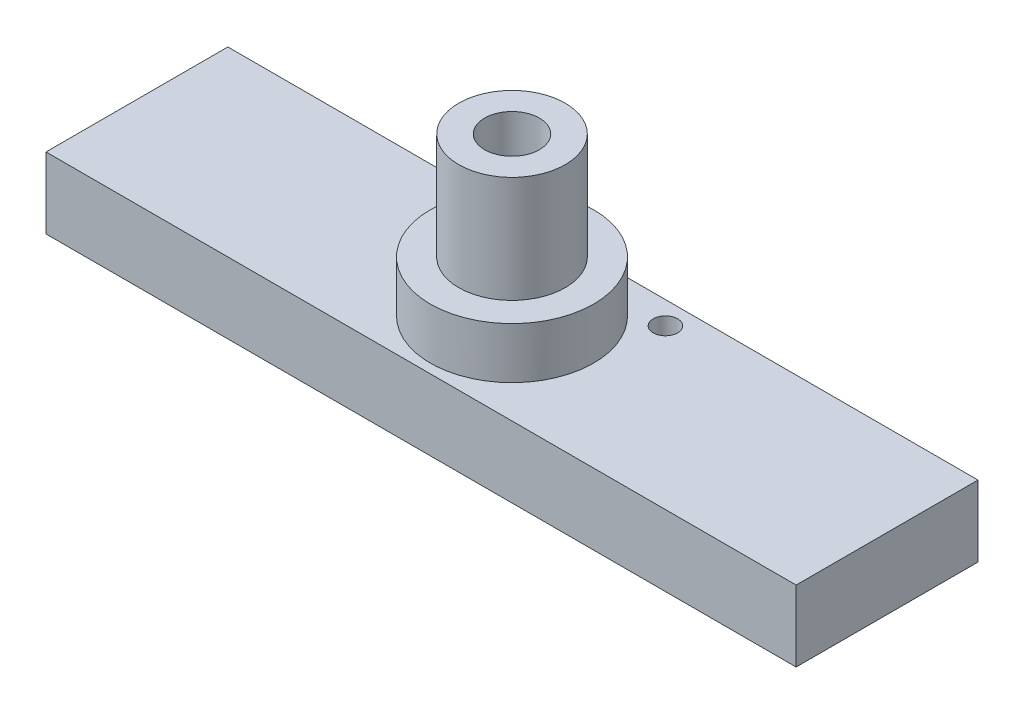
ISO-10303-21;
HEADER;
FILE_DESCRIPTION(('STEP AP214'),'2;1');
FILE_NAME('part.step','',(''),(''),'','','');
FILE_SCHEMA(('AUTOMOTIVE_DESIGN { 1 0 10303 214 1 1 1 1 }'));
ENDSEC;
DATA;
#1=APPLICATION_CONTEXT('core data for automotive mechanical design processes');
#2=APPLICATION_PROTOCOL_DEFINITION('international standard','automotive_design',2000,#1);
#3=PRODUCT_CONTEXT('',#1,'mechanical');
#4=PRODUCT('Part','Part','',(#3));
#5=PRODUCT_RELATED_PRODUCT_CATEGORY('part','',(#4));
#6=PRODUCT_DEFINITION_FORMATION('','',#4);
#7=PRODUCT_DEFINITION_CONTEXT('part definition',#1,'design');
#8=PRODUCT_DEFINITION('design','',#6,#7);
#9=PRODUCT_DEFINITION_SHAPE('','',#8);
#10=(LENGTH_UNIT() NAMED_UNIT(*) SI_UNIT(.MILLI.,.METRE.));
#11=(NAMED_UNIT(*) PLANE_ANGLE_UNIT() SI_UNIT($,.RADIAN.));
#12=(NAMED_UNIT(*) SI_UNIT($,.STERADIAN.) SOLID_ANGLE_UNIT());
#13=UNCERTAINTY_MEASURE_WITH_UNIT(LENGTH_MEASURE(1.E-05),#10,'distance_accuracy_value','');
#14=(GEOMETRIC_REPRESENTATION_CONTEXT(3) GLOBAL_UNCERTAINTY_ASSIGNED_CONTEXT((#13)) GLOBAL_UNIT_ASSIGNED_CONTEXT((#10,
#11,#12)) REPRESENTATION_CONTEXT('',''));
#15=CARTESIAN_POINT('',(0.,0.,0.));
#16=DIRECTION('',(0.,0.,1.));
#17=DIRECTION('',(1.,0.,0.));
#18=AXIS2_PLACEMENT_3D('',#15,#16,#17);
#19=CARTESIAN_POINT('',(0.,6.35,0.));
#20=DIRECTION('',(0.,-1.,0.));
#21=DIRECTION('',(0.,0.,-1.));
#22=AXIS2_PLACEMENT_3D('',#19,#20,#21);
#23=PLANE('',#22);
#24=DIRECTION('',(0.,0.,1.));
#25=VECTOR('',#24,1.);
#26=CARTESIAN_POINT('',(0.,6.35,0.));
#27=LINE('',#26,#25);
#28=CARTESIAN_POINT('',(0.,6.35,-16.256));
#29=VERTEX_POINT('',#28);
#30=CARTESIAN_POINT('',(0.,6.35,0.));
#31=VERTEX_POINT('',#30);
#32=EDGE_CURVE('E86',#29,#31,#27,.T.);
#33=ORIENTED_EDGE('',*,*,#32,.T.);
#34=DIRECTION('',(1.,0.,0.));
#35=VECTOR('',#34,1.);
#36=CARTESIAN_POINT('',(0.,6.35,0.));
#37=LINE('',#36,#35);
#38=CARTESIAN_POINT('',(67.056,6.35,0.));
#39=VERTEX_POINT('',#38);
#40=EDGE_CURVE('E81',#31,#39,#37,.T.);
#41=ORIENTED_EDGE('',*,*,#40,.T.);
#42=DIRECTION('',(0.,0.,-1.));
#43=VECTOR('',#42,1.);
#44=CARTESIAN_POINT('',(67.056,6.35,0.));
#45=LINE('',#44,#43);
#46=CARTESIAN_POINT('',(67.056,6.35,-16.256));
#47=VERTEX_POINT('',#46);
#48=EDGE_CURVE('E84',#39,#47,#45,.T.);
#49=ORIENTED_EDGE('',*,*,#48,.T.);
#50=DIRECTION('',(-1.,0.,0.));
#51=VECTOR('',#50,1.);
#52=CARTESIAN_POINT('',(0.,6.35,-16.256));
#53=LINE('',#52,#51);
#54=EDGE_CURVE('E50',#47,#29,#53,.T.);
#55=ORIENTED_EDGE('',*,*,#54,.T.);
#56=EDGE_LOOP('',(#33,#41,#49,#55));
#57=FACE_BOUND('',#56,.T.);
#58=CARTESIAN_POINT('',(25.908,6.35,-14.224));
#59=DIRECTION('',(0.,-1.,0.));
#60=DIRECTION('',(0.,0.,-1.));
#61=AXIS2_PLACEMENT_3D('',#58,#59,#60);
#62=CIRCLE('',#61,1.0922);
#63=CARTESIAN_POINT('',(25.908,6.35,-15.3162));
#64=VERTEX_POINT('',#63);
#65=EDGE_CURVE('E176',#64,#64,#62,.F.);
#66=ORIENTED_EDGE('',*,*,#65,.F.);
#67=EDGE_LOOP('',(#66));
#68=FACE_BOUND('',#67,.T.);
#69=CARTESIAN_POINT('',(41.148,6.35,-14.224));
#70=DIRECTION('',(0.,-1.,0.));
#71=DIRECTION('',(0.,0.,-1.));
#72=AXIS2_PLACEMENT_3D('',#69,#70,#71);
#73=CIRCLE('',#72,1.0922);
#74=CARTESIAN_POINT('',(41.148,6.35,-15.3162));
#75=VERTEX_POINT('',#74);
#76=EDGE_CURVE('E170',#75,#75,#73,.F.);
#77=ORIENTED_EDGE('',*,*,#76,.F.);
#78=EDGE_LOOP('',(#77));
#79=FACE_BOUND('',#78,.T.);
#80=CARTESIAN_POINT('',(33.528,6.35,-8.128));
#81=DIRECTION('',(0.,-1.,0.));
#82=DIRECTION('',(0.,0.,-1.));
#83=AXIS2_PLACEMENT_3D('',#80,#81,#82);
#84=CIRCLE('',#83,7.30250000000002);
#85=CARTESIAN_POINT('',(33.528,6.35,-15.4305));
#86=VERTEX_POINT('',#85);
#87=EDGE_CURVE('E11',#86,#86,#84,.F.);
#88=ORIENTED_EDGE('',*,*,#87,.F.);
#89=EDGE_LOOP('',(#88));
#90=FACE_BOUND('',#89,.T.);
#91=ADVANCED_FACE('F33',(#57,#68,#79,#90),#23,.F.);
#92=CARTESIAN_POINT('',(0.,6.35,0.));
#93=DIRECTION('',(1.,0.,0.));
#94=DIRECTION('',(0.,0.,-1.));
#95=AXIS2_PLACEMENT_3D('',#92,#93,#94);
#96=PLANE('',#95);
#97=DIRECTION('',(0.,0.,1.));
#98=VECTOR('',#97,1.);
#99=CARTESIAN_POINT('',(0.,0.,0.));
#100=LINE('',#99,#98);
#101=CARTESIAN_POINT('',(0.,0.,-16.256));
#102=VERTEX_POINT('',#101);
#103=CARTESIAN_POINT('',(0.,0.,0.));
#104=VERTEX_POINT('',#103);
#105=EDGE_CURVE('E100',#102,#104,#100,.T.);
#106=ORIENTED_EDGE('',*,*,#105,.T.);
#107=DIRECTION('',(0.,-1.,0.));
#108=VECTOR('',#107,1.);
#109=CARTESIAN_POINT('',(0.,6.35,0.));
#110=LINE('',#109,#108);
#111=EDGE_CURVE('E42',#31,#104,#110,.T.);
#112=ORIENTED_EDGE('',*,*,#111,.F.);
#113=ORIENTED_EDGE('',*,*,#32,.F.);
#114=DIRECTION('',(0.,-1.,0.));
#115=VECTOR('',#114,1.);
#116=CARTESIAN_POINT('',(0.,6.35,-16.256));
#117=LINE('',#116,#115);
#118=EDGE_CURVE('E96',#29,#102,#117,.T.);
#119=ORIENTED_EDGE('',*,*,#118,.T.);
#120=EDGE_LOOP('',(#106,#112,#113,#119));
#121=FACE_BOUND('',#120,.T.);
#122=ADVANCED_FACE('F35',(#121),#96,.F.);
#123=CARTESIAN_POINT('',(0.,6.35,0.));
#124=DIRECTION('',(0.,0.,-1.));
#125=DIRECTION('',(-1.,0.,0.));
#126=AXIS2_PLACEMENT_3D('',#123,#124,#125);
#127=PLANE('',#126);
#128=DIRECTION('',(1.,0.,0.));
#129=VECTOR('',#128,1.);
#130=CARTESIAN_POINT('',(0.,0.,0.));
#131=LINE('',#130,#129);
#132=CARTESIAN_POINT('',(67.056,0.,0.));
#133=VERTEX_POINT('',#132);
#134=EDGE_CURVE('E91',#104,#133,#131,.T.);
#135=ORIENTED_EDGE('',*,*,#134,.T.);
#136=DIRECTION('',(0.,-1.,0.));
#137=VECTOR('',#136,1.);
#138=CARTESIAN_POINT('',(67.056,6.35,0.));
#139=LINE('',#138,#137);
#140=EDGE_CURVE('E89',#39,#133,#139,.T.);
#141=ORIENTED_EDGE('',*,*,#140,.F.);
#142=ORIENTED_EDGE('',*,*,#40,.F.);
#143=ORIENTED_EDGE('',*,*,#111,.T.);
#144=EDGE_LOOP('',(#135,#141,#142,#143));
#145=FACE_BOUND('',#144,.T.);
#146=ADVANCED_FACE('F90',(#145),#127,.F.);
#147=CARTESIAN_POINT('',(67.056,6.35,0.));
#148=DIRECTION('',(-1.,0.,0.));
#149=DIRECTION('',(0.,0.,1.));
#150=AXIS2_PLACEMENT_3D('',#147,#148,#149);
#151=PLANE('',#150);
#152=DIRECTION('',(0.,0.,-1.));
#153=VECTOR('',#152,1.);
#154=CARTESIAN_POINT('',(67.056,0.,0.));
#155=LINE('',#154,#153);
#156=CARTESIAN_POINT('',(67.056,0.,-16.256));
#157=VERTEX_POINT('',#156);
#158=EDGE_CURVE('E67',#133,#157,#155,.T.);
#159=ORIENTED_EDGE('',*,*,#158,.T.);
#160=DIRECTION('',(0.,-1.,0.));
#161=VECTOR('',#160,1.);
#162=CARTESIAN_POINT('',(67.056,6.35,-16.256));
#163=LINE('',#162,#161);
#164=EDGE_CURVE('E92',#47,#157,#163,.T.);
#165=ORIENTED_EDGE('',*,*,#164,.F.);
#166=ORIENTED_EDGE('',*,*,#48,.F.);
#167=ORIENTED_EDGE('',*,*,#140,.T.);
#168=EDGE_LOOP('',(#159,#165,#166,#167));
#169=FACE_BOUND('',#168,.T.);
#170=ADVANCED_FACE('F94',(#169),#151,.F.);
#171=CARTESIAN_POINT('',(0.,6.35,-16.256));
#172=DIRECTION('',(0.,0.,1.));
#173=DIRECTION('',(1.,0.,0.));
#174=AXIS2_PLACEMENT_3D('',#171,#172,#173);
#175=PLANE('',#174);
#176=DIRECTION('',(-1.,0.,0.));
#177=VECTOR('',#176,1.);
#178=CARTESIAN_POINT('',(0.,0.,-16.256));
#179=LINE('',#178,#177);
#180=EDGE_CURVE('E73',#157,#102,#179,.T.);
#181=ORIENTED_EDGE('',*,*,#180,.T.);
#182=ORIENTED_EDGE('',*,*,#118,.F.);
#183=ORIENTED_EDGE('',*,*,#54,.F.);
#184=ORIENTED_EDGE('',*,*,#164,.T.);
#185=EDGE_LOOP('',(#181,#182,#183,#184));
#186=FACE_BOUND('',#185,.T.);
#187=ADVANCED_FACE('F114',(#186),#175,.F.);
#188=CARTESIAN_POINT('',(0.,0.,0.));
#189=DIRECTION('',(0.,-1.,0.));
#190=DIRECTION('',(0.,0.,-1.));
#191=AXIS2_PLACEMENT_3D('',#188,#189,#190);
#192=PLANE('',#191);
#193=CARTESIAN_POINT('',(41.148,0.,-14.224));
#194=DIRECTION('',(0.,-1.,0.));
#195=DIRECTION('',(0.,0.,-1.));
#196=AXIS2_PLACEMENT_3D('',#193,#194,#195);
#197=CIRCLE('',#196,1.0922);
#198=CARTESIAN_POINT('',(41.148,0.,-15.3162));
#199=VERTEX_POINT('',#198);
#200=EDGE_CURVE('E165',#199,#199,#197,.T.);
#201=ORIENTED_EDGE('',*,*,#200,.F.);
#202=EDGE_LOOP('',(#201));
#203=FACE_BOUND('',#202,.T.);
#204=CARTESIAN_POINT('',(25.908,0.,-14.224));
#205=DIRECTION('',(0.,-1.,0.));
#206=DIRECTION('',(0.,0.,-1.));
#207=AXIS2_PLACEMENT_3D('',#204,#205,#206);
#208=CIRCLE('',#207,1.0922);
#209=CARTESIAN_POINT('',(25.908,0.,-15.3162));
#210=VERTEX_POINT('',#209);
#211=EDGE_CURVE('E173',#210,#210,#208,.T.);
#212=ORIENTED_EDGE('',*,*,#211,.F.);
#213=EDGE_LOOP('',(#212));
#214=FACE_BOUND('',#213,.T.);
#215=CARTESIAN_POINT('',(33.528,0.,-8.128));
#216=DIRECTION('',(0.,1.,0.));
#217=DIRECTION('',(0.,0.,1.));
#218=AXIS2_PLACEMENT_3D('',#215,#216,#217);
#219=CIRCLE('',#218,2.45110000000001);
#220=CARTESIAN_POINT('',(33.528,0.,-5.67689999999999));
#221=VERTEX_POINT('',#220);
#222=EDGE_CURVE('E180',#221,#221,#219,.T.);
#223=ORIENTED_EDGE('',*,*,#222,.T.);
#224=EDGE_LOOP('',(#223));
#225=FACE_BOUND('',#224,.T.);
#226=ORIENTED_EDGE('',*,*,#105,.F.);
#227=ORIENTED_EDGE('',*,*,#180,.F.);
#228=ORIENTED_EDGE('',*,*,#158,.F.);
#229=ORIENTED_EDGE('',*,*,#134,.F.);
#230=EDGE_LOOP('',(#226,#227,#228,#229));
#231=FACE_BOUND('',#230,.T.);
#232=ADVANCED_FACE('F111',(#203,#214,#225,#231),#192,.T.);
#233=CARTESIAN_POINT('',(33.528,20.447,-8.128));
#234=DIRECTION('',(0.,-1.,0.));
#235=DIRECTION('',(0.,0.,-1.));
#236=AXIS2_PLACEMENT_3D('',#233,#234,#235);
#237=CYLINDRICAL_SURFACE('',#236,4.76250000000002);
#238=CARTESIAN_POINT('',(33.528,10.922,-8.128));
#239=DIRECTION('',(0.,1.,0.));
#240=DIRECTION('',(0.,0.,1.));
#241=AXIS2_PLACEMENT_3D('',#238,#239,#240);
#242=CIRCLE('',#241,4.76250000000002);
#243=CARTESIAN_POINT('',(33.528,10.922,-3.36549999999998));
#244=VERTEX_POINT('',#243);
#245=EDGE_CURVE('E163',#244,#244,#242,.T.);
#246=ORIENTED_EDGE('',*,*,#245,.T.);
#247=EDGE_LOOP('',(#246));
#248=FACE_BOUND('',#247,.T.);
#249=CARTESIAN_POINT('',(33.528,20.447,-8.128));
#250=DIRECTION('',(0.,1.,0.));
#251=DIRECTION('',(0.,0.,1.));
#252=AXIS2_PLACEMENT_3D('',#249,#250,#251);
#253=CIRCLE('',#252,4.76250000000002);
#254=CARTESIAN_POINT('',(33.528,20.447,-3.36549999999998));
#255=VERTEX_POINT('',#254);
#256=EDGE_CURVE('E103',#255,#255,#253,.T.);
#257=ORIENTED_EDGE('',*,*,#256,.F.);
#258=EDGE_LOOP('',(#257));
#259=FACE_BOUND('',#258,.T.);
#260=ADVANCED_FACE('F113',(#248,#259),#237,.T.);
#261=CARTESIAN_POINT('',(33.528,20.447,-8.128));
#262=DIRECTION('',(0.,1.,0.));
#263=DIRECTION('',(0.,0.,1.));
#264=AXIS2_PLACEMENT_3D('',#261,#262,#263);
#265=PLANE('',#264);
#266=CARTESIAN_POINT('',(33.528,20.447,-8.128));
#267=DIRECTION('',(0.,1.,0.));
#268=DIRECTION('',(0.,0.,1.));
#269=AXIS2_PLACEMENT_3D('',#266,#267,#268);
#270=CIRCLE('',#269,2.45110000000001);
#271=CARTESIAN_POINT('',(33.528,20.447,-5.67689999999999));
#272=VERTEX_POINT('',#271);
#273=EDGE_CURVE('E179',#272,#272,#270,.T.);
#274=ORIENTED_EDGE('',*,*,#273,.F.);
#275=EDGE_LOOP('',(#274));
#276=FACE_BOUND('',#275,.T.);
#277=ORIENTED_EDGE('',*,*,#256,.T.);
#278=EDGE_LOOP('',(#277));
#279=FACE_BOUND('',#278,.T.);
#280=ADVANCED_FACE('F121',(#276,#279),#265,.T.);
#281=CARTESIAN_POINT('',(33.528,0.,-8.128));
#282=DIRECTION('',(0.,1.,0.));
#283=DIRECTION('',(0.,0.,1.));
#284=AXIS2_PLACEMENT_3D('',#281,#282,#283);
#285=CYLINDRICAL_SURFACE('',#284,2.45110000000001);
#286=ORIENTED_EDGE('',*,*,#222,.F.);
#287=EDGE_LOOP('',(#286));
#288=FACE_BOUND('',#287,.T.);
#289=ORIENTED_EDGE('',*,*,#273,.T.);
#290=EDGE_LOOP('',(#289));
#291=FACE_BOUND('',#290,.T.);
#292=ADVANCED_FACE('F135',(#288,#291),#285,.F.);
#293=CARTESIAN_POINT('',(25.908,20.448,-14.224));
#294=DIRECTION('',(0.,-1.,0.));
#295=DIRECTION('',(0.,0.,-1.));
#296=AXIS2_PLACEMENT_3D('',#293,#294,#295);
#297=CYLINDRICAL_SURFACE('',#296,1.0922);
#298=ORIENTED_EDGE('',*,*,#211,.T.);
#299=EDGE_LOOP('',(#298));
#300=FACE_BOUND('',#299,.T.);
#301=ORIENTED_EDGE('',*,*,#65,.T.);
#302=EDGE_LOOP('',(#301));
#303=FACE_BOUND('',#302,.T.);
#304=ADVANCED_FACE('F139',(#300,#303),#297,.F.);
#305=CARTESIAN_POINT('',(41.148,20.448,-14.224));
#306=DIRECTION('',(0.,-1.,0.));
#307=DIRECTION('',(0.,0.,-1.));
#308=AXIS2_PLACEMENT_3D('',#305,#306,#307);
#309=CYLINDRICAL_SURFACE('',#308,1.0922);
#310=ORIENTED_EDGE('',*,*,#200,.T.);
#311=EDGE_LOOP('',(#310));
#312=FACE_BOUND('',#311,.T.);
#313=ORIENTED_EDGE('',*,*,#76,.T.);
#314=EDGE_LOOP('',(#313));
#315=FACE_BOUND('',#314,.T.);
#316=ADVANCED_FACE('F143',(#312,#315),#309,.F.);
#317=CARTESIAN_POINT('',(33.528,10.922,-8.128));
#318=DIRECTION('',(0.,1.,0.));
#319=DIRECTION('',(0.,0.,1.));
#320=AXIS2_PLACEMENT_3D('',#317,#318,#319);
#321=PLANE('',#320);
#322=CARTESIAN_POINT('',(33.528,10.922,-8.128));
#323=DIRECTION('',(0.,1.,0.));
#324=DIRECTION('',(0.,0.,1.));
#325=AXIS2_PLACEMENT_3D('',#322,#323,#324);
#326=CIRCLE('',#325,7.30250000000002);
#327=CARTESIAN_POINT('',(33.528,10.922,-0.825499999999979));
#328=VERTEX_POINT('',#327);
#329=EDGE_CURVE('E160',#328,#328,#326,.T.);
#330=ORIENTED_EDGE('',*,*,#329,.T.);
#331=EDGE_LOOP('',(#330));
#332=FACE_BOUND('',#331,.T.);
#333=ORIENTED_EDGE('',*,*,#245,.F.);
#334=EDGE_LOOP('',(#333));
#335=FACE_BOUND('',#334,.T.);
#336=ADVANCED_FACE('F147',(#332,#335),#321,.T.);
#337=CARTESIAN_POINT('',(33.528,10.922,-8.128));
#338=DIRECTION('',(0.,-1.,0.));
#339=DIRECTION('',(0.,0.,-1.));
#340=AXIS2_PLACEMENT_3D('',#337,#338,#339);
#341=CYLINDRICAL_SURFACE('',#340,7.30250000000002);
#342=ORIENTED_EDGE('',*,*,#329,.F.);
#343=EDGE_LOOP('',(#342));
#344=FACE_BOUND('',#343,.T.);
#345=ORIENTED_EDGE('',*,*,#87,.T.);
#346=EDGE_LOOP('',(#345));
#347=FACE_BOUND('',#346,.T.);
#348=ADVANCED_FACE('F149',(#344,#347),#341,.T.);
#349=CLOSED_SHELL('',(#91,#122,#146,#170,#187,#232,#260,#280,#292,#304,#316,#336,#348));
#350=MANIFOLD_SOLID_BREP('B2',#349);
#351=ADVANCED_BREP_SHAPE_REPRESENTATION('',(#18,#350),#14);
#352=SHAPE_DEFINITION_REPRESENTATION(#9,#351);
ENDSEC;
END-ISO-10303-21;
